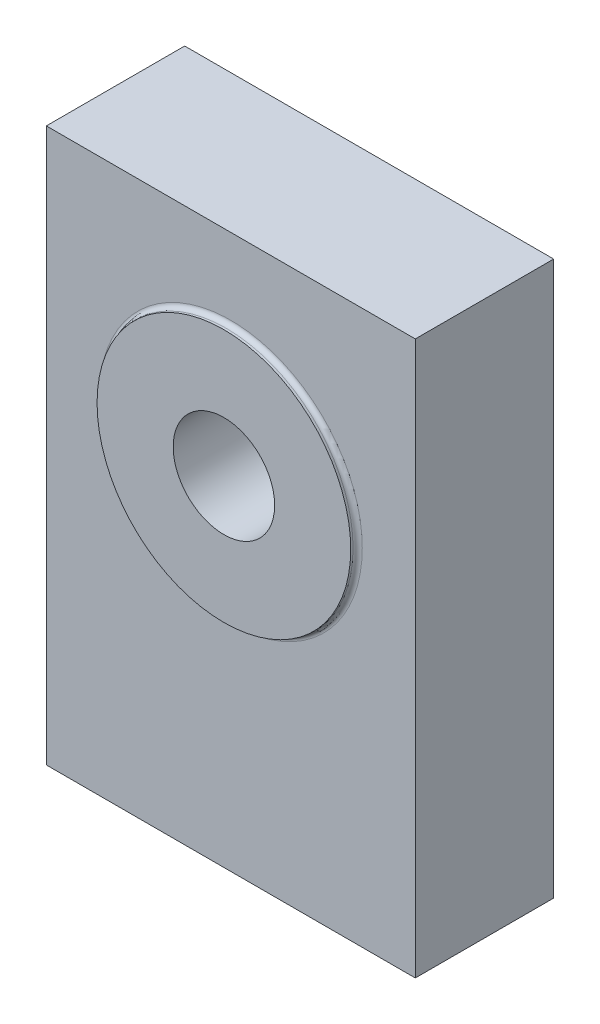
ISO-10303-21;
HEADER;
FILE_DESCRIPTION(('STEP AP214'),'2;1');
FILE_NAME('part.step','',(''),(''),'','','');
FILE_SCHEMA(('AUTOMOTIVE_DESIGN { 1 0 10303 214 1 1 1 1 }'));
ENDSEC;
DATA;
#1=APPLICATION_CONTEXT('core data for automotive mechanical design processes');
#2=APPLICATION_PROTOCOL_DEFINITION('international standard','automotive_design',2000,#1);
#3=PRODUCT_CONTEXT('',#1,'mechanical');
#4=PRODUCT('Part','Part','',(#3));
#5=PRODUCT_RELATED_PRODUCT_CATEGORY('part','',(#4));
#6=PRODUCT_DEFINITION_FORMATION('','',#4);
#7=PRODUCT_DEFINITION_CONTEXT('part definition',#1,'design');
#8=PRODUCT_DEFINITION('design','',#6,#7);
#9=PRODUCT_DEFINITION_SHAPE('','',#8);
#10=(LENGTH_UNIT() NAMED_UNIT(*) SI_UNIT(.MILLI.,.METRE.));
#11=(NAMED_UNIT(*) PLANE_ANGLE_UNIT() SI_UNIT($,.RADIAN.));
#12=(NAMED_UNIT(*) SI_UNIT($,.STERADIAN.) SOLID_ANGLE_UNIT());
#13=UNCERTAINTY_MEASURE_WITH_UNIT(LENGTH_MEASURE(1.E-05),#10,'distance_accuracy_value','');
#14=(GEOMETRIC_REPRESENTATION_CONTEXT(3) GLOBAL_UNCERTAINTY_ASSIGNED_CONTEXT((#13)) GLOBAL_UNIT_ASSIGNED_CONTEXT((#10,
#11,#12)) REPRESENTATION_CONTEXT('',''));
#15=CARTESIAN_POINT('',(0.,0.,0.));
#16=DIRECTION('',(0.,0.,1.));
#17=DIRECTION('',(1.,0.,0.));
#18=AXIS2_PLACEMENT_3D('',#15,#16,#17);
#19=CARTESIAN_POINT('',(-40.,120.,15.));
#20=DIRECTION('',(0.,0.,-1.));
#21=DIRECTION('',(-1.,0.,0.));
#22=AXIS2_PLACEMENT_3D('',#19,#20,#21);
#23=PLANE('',#22);
#24=CARTESIAN_POINT('',(0.,75.,15.));
#25=DIRECTION('',(0.,0.,-1.));
#26=DIRECTION('',(-1.,0.,0.));
#27=AXIS2_PLACEMENT_3D('',#24,#25,#26);
#28=CIRCLE('',#27,28.5);
#29=CARTESIAN_POINT('',(-28.5,75.,15.));
#30=VERTEX_POINT('',#29);
#31=EDGE_CURVE('E11',#30,#30,#28,.T.);
#32=ORIENTED_EDGE('',*,*,#31,.T.);
#33=EDGE_LOOP('',(#32));
#34=FACE_BOUND('',#33,.T.);
#35=DIRECTION('',(1.,0.,0.));
#36=VECTOR('',#35,1.);
#37=CARTESIAN_POINT('',(-40.,0.,15.));
#38=LINE('',#37,#36);
#39=CARTESIAN_POINT('',(-40.,0.,15.));
#40=VERTEX_POINT('',#39);
#41=CARTESIAN_POINT('',(40.,0.,15.));
#42=VERTEX_POINT('',#41);
#43=EDGE_CURVE('E72',#40,#42,#38,.T.);
#44=ORIENTED_EDGE('',*,*,#43,.T.);
#45=DIRECTION('',(0.,-1.,0.));
#46=VECTOR('',#45,1.);
#47=CARTESIAN_POINT('',(40.,120.,15.));
#48=LINE('',#47,#46);
#49=CARTESIAN_POINT('',(40.,120.,15.));
#50=VERTEX_POINT('',#49);
#51=EDGE_CURVE('E96',#50,#42,#48,.T.);
#52=ORIENTED_EDGE('',*,*,#51,.F.);
#53=DIRECTION('',(1.,0.,0.));
#54=VECTOR('',#53,1.);
#55=CARTESIAN_POINT('',(-40.,120.,15.));
#56=LINE('',#55,#54);
#57=CARTESIAN_POINT('',(-40.,120.,15.));
#58=VERTEX_POINT('',#57);
#59=EDGE_CURVE('E49',#58,#50,#56,.T.);
#60=ORIENTED_EDGE('',*,*,#59,.F.);
#61=DIRECTION('',(0.,-1.,0.));
#62=VECTOR('',#61,1.);
#63=CARTESIAN_POINT('',(-40.,120.,15.));
#64=LINE('',#63,#62);
#65=EDGE_CURVE('E92',#58,#40,#64,.T.);
#66=ORIENTED_EDGE('',*,*,#65,.T.);
#67=EDGE_LOOP('',(#44,#52,#60,#66));
#68=FACE_BOUND('',#67,.T.);
#69=ADVANCED_FACE('F32',(#34,#68),#23,.F.);
#70=CARTESIAN_POINT('',(40.,120.,15.));
#71=DIRECTION('',(-1.,0.,0.));
#72=DIRECTION('',(0.,0.,1.));
#73=AXIS2_PLACEMENT_3D('',#70,#71,#72);
#74=PLANE('',#73);
#75=DIRECTION('',(0.,0.,-1.));
#76=VECTOR('',#75,1.);
#77=CARTESIAN_POINT('',(40.,0.,15.));
#78=LINE('',#77,#76);
#79=CARTESIAN_POINT('',(40.,0.,-15.));
#80=VERTEX_POINT('',#79);
#81=EDGE_CURVE('E100',#42,#80,#78,.T.);
#82=ORIENTED_EDGE('',*,*,#81,.T.);
#83=DIRECTION('',(0.,-1.,0.));
#84=VECTOR('',#83,1.);
#85=CARTESIAN_POINT('',(40.,120.,-15.));
#86=LINE('',#85,#84);
#87=CARTESIAN_POINT('',(40.,120.,-15.));
#88=VERTEX_POINT('',#87);
#89=EDGE_CURVE('E91',#88,#80,#86,.T.);
#90=ORIENTED_EDGE('',*,*,#89,.F.);
#91=DIRECTION('',(0.,0.,-1.));
#92=VECTOR('',#91,1.);
#93=CARTESIAN_POINT('',(40.,120.,15.));
#94=LINE('',#93,#92);
#95=EDGE_CURVE('E85',#50,#88,#94,.T.);
#96=ORIENTED_EDGE('',*,*,#95,.F.);
#97=ORIENTED_EDGE('',*,*,#51,.T.);
#98=EDGE_LOOP('',(#82,#90,#96,#97));
#99=FACE_BOUND('',#98,.T.);
#100=ADVANCED_FACE('F126',(#99),#74,.F.);
#101=CARTESIAN_POINT('',(-40.,120.,-15.));
#102=DIRECTION('',(0.,0.,1.));
#103=DIRECTION('',(1.,0.,0.));
#104=AXIS2_PLACEMENT_3D('',#101,#102,#103);
#105=PLANE('',#104);
#106=CARTESIAN_POINT('',(0.,75.,-15.));
#107=DIRECTION('',(0.,0.,1.));
#108=DIRECTION('',(1.,0.,0.));
#109=AXIS2_PLACEMENT_3D('',#106,#107,#108);
#110=CIRCLE('',#109,11.);
#111=CARTESIAN_POINT('',(11.,75.,-15.));
#112=VERTEX_POINT('',#111);
#113=EDGE_CURVE('E145',#112,#112,#110,.T.);
#114=ORIENTED_EDGE('',*,*,#113,.T.);
#115=EDGE_LOOP('',(#114));
#116=FACE_BOUND('',#115,.T.);
#117=DIRECTION('',(-1.,0.,0.));
#118=VECTOR('',#117,1.);
#119=CARTESIAN_POINT('',(-40.,0.,-15.));
#120=LINE('',#119,#118);
#121=CARTESIAN_POINT('',(-40.,0.,-15.));
#122=VERTEX_POINT('',#121);
#123=EDGE_CURVE('E90',#80,#122,#120,.T.);
#124=ORIENTED_EDGE('',*,*,#123,.T.);
#125=DIRECTION('',(0.,-1.,0.));
#126=VECTOR('',#125,1.);
#127=CARTESIAN_POINT('',(-40.,120.,-15.));
#128=LINE('',#127,#126);
#129=CARTESIAN_POINT('',(-40.,120.,-15.));
#130=VERTEX_POINT('',#129);
#131=EDGE_CURVE('E88',#130,#122,#128,.T.);
#132=ORIENTED_EDGE('',*,*,#131,.F.);
#133=DIRECTION('',(-1.,0.,0.));
#134=VECTOR('',#133,1.);
#135=CARTESIAN_POINT('',(-40.,120.,-15.));
#136=LINE('',#135,#134);
#137=EDGE_CURVE('E80',#88,#130,#136,.T.);
#138=ORIENTED_EDGE('',*,*,#137,.F.);
#139=ORIENTED_EDGE('',*,*,#89,.T.);
#140=EDGE_LOOP('',(#124,#132,#138,#139));
#141=FACE_BOUND('',#140,.T.);
#142=ADVANCED_FACE('F89',(#116,#141),#105,.F.);
#143=CARTESIAN_POINT('',(-40.,120.,15.));
#144=DIRECTION('',(1.,0.,0.));
#145=DIRECTION('',(0.,0.,-1.));
#146=AXIS2_PLACEMENT_3D('',#143,#144,#145);
#147=PLANE('',#146);
#148=DIRECTION('',(0.,0.,1.));
#149=VECTOR('',#148,1.);
#150=CARTESIAN_POINT('',(-40.,0.,15.));
#151=LINE('',#150,#149);
#152=EDGE_CURVE('E66',#122,#40,#151,.T.);
#153=ORIENTED_EDGE('',*,*,#152,.T.);
#154=ORIENTED_EDGE('',*,*,#65,.F.);
#155=DIRECTION('',(0.,0.,1.));
#156=VECTOR('',#155,1.);
#157=CARTESIAN_POINT('',(-40.,120.,15.));
#158=LINE('',#157,#156);
#159=EDGE_CURVE('E83',#130,#58,#158,.T.);
#160=ORIENTED_EDGE('',*,*,#159,.F.);
#161=ORIENTED_EDGE('',*,*,#131,.T.);
#162=EDGE_LOOP('',(#153,#154,#160,#161));
#163=FACE_BOUND('',#162,.T.);
#164=ADVANCED_FACE('F94',(#163),#147,.F.);
#165=CARTESIAN_POINT('',(0.,120.,0.));
#166=DIRECTION('',(0.,-1.,0.));
#167=DIRECTION('',(0.,0.,-1.));
#168=AXIS2_PLACEMENT_3D('',#165,#166,#167);
#169=PLANE('',#168);
#170=ORIENTED_EDGE('',*,*,#95,.T.);
#171=ORIENTED_EDGE('',*,*,#137,.T.);
#172=ORIENTED_EDGE('',*,*,#159,.T.);
#173=ORIENTED_EDGE('',*,*,#59,.T.);
#174=EDGE_LOOP('',(#170,#171,#172,#173));
#175=FACE_BOUND('',#174,.T.);
#176=ADVANCED_FACE('F81',(#175),#169,.F.);
#177=CARTESIAN_POINT('',(0.,0.,0.));
#178=DIRECTION('',(0.,-1.,0.));
#179=DIRECTION('',(0.,0.,-1.));
#180=AXIS2_PLACEMENT_3D('',#177,#178,#179);
#181=PLANE('',#180);
#182=ORIENTED_EDGE('',*,*,#81,.F.);
#183=ORIENTED_EDGE('',*,*,#43,.F.);
#184=ORIENTED_EDGE('',*,*,#152,.F.);
#185=ORIENTED_EDGE('',*,*,#123,.F.);
#186=EDGE_LOOP('',(#182,#183,#184,#185));
#187=FACE_BOUND('',#186,.T.);
#188=ADVANCED_FACE('F135',(#187),#181,.T.);
#189=CARTESIAN_POINT('',(0.,75.,16.5));
#190=DIRECTION('',(0.,0.,-1.));
#191=DIRECTION('',(-1.,0.,0.));
#192=AXIS2_PLACEMENT_3D('',#189,#190,#191);
#193=CYLINDRICAL_SURFACE('',#192,27.5);
#194=CARTESIAN_POINT('',(0.,75.,16.));
#195=DIRECTION('',(0.,0.,-1.));
#196=DIRECTION('',(-1.,0.,0.));
#197=AXIS2_PLACEMENT_3D('',#194,#195,#196);
#198=CIRCLE('',#197,27.5);
#199=CARTESIAN_POINT('',(-27.5,75.,16.));
#200=VERTEX_POINT('',#199);
#201=EDGE_CURVE('E41',#200,#200,#198,.F.);
#202=ORIENTED_EDGE('',*,*,#201,.T.);
#203=EDGE_LOOP('',(#202));
#204=FACE_BOUND('',#203,.T.);
#205=CARTESIAN_POINT('',(0.,75.,16.5));
#206=DIRECTION('',(0.,0.,1.));
#207=DIRECTION('',(1.,0.,0.));
#208=AXIS2_PLACEMENT_3D('',#205,#206,#207);
#209=CIRCLE('',#208,27.5);
#210=CARTESIAN_POINT('',(27.5,75.,16.5));
#211=VERTEX_POINT('',#210);
#212=EDGE_CURVE('E103',#211,#211,#209,.T.);
#213=ORIENTED_EDGE('',*,*,#212,.F.);
#214=EDGE_LOOP('',(#213));
#215=FACE_BOUND('',#214,.T.);
#216=ADVANCED_FACE('F112',(#204,#215),#193,.T.);
#217=CARTESIAN_POINT('',(0.,75.,16.5));
#218=DIRECTION('',(0.,0.,1.));
#219=DIRECTION('',(1.,0.,0.));
#220=AXIS2_PLACEMENT_3D('',#217,#218,#219);
#221=PLANE('',#220);
#222=CARTESIAN_POINT('',(0.,75.,16.5));
#223=DIRECTION('',(0.,0.,1.));
#224=DIRECTION('',(1.,0.,0.));
#225=AXIS2_PLACEMENT_3D('',#222,#223,#224);
#226=CIRCLE('',#225,11.);
#227=CARTESIAN_POINT('',(11.,75.,16.5));
#228=VERTEX_POINT('',#227);
#229=EDGE_CURVE('E147',#228,#228,#226,.T.);
#230=ORIENTED_EDGE('',*,*,#229,.F.);
#231=EDGE_LOOP('',(#230));
#232=FACE_BOUND('',#231,.T.);
#233=ORIENTED_EDGE('',*,*,#212,.T.);
#234=EDGE_LOOP('',(#233));
#235=FACE_BOUND('',#234,.T.);
#236=ADVANCED_FACE('F121',(#232,#235),#221,.T.);
#237=CARTESIAN_POINT('',(0.,75.,-23.));
#238=DIRECTION('',(0.,0.,1.));
#239=DIRECTION('',(1.,0.,0.));
#240=AXIS2_PLACEMENT_3D('',#237,#238,#239);
#241=CYLINDRICAL_SURFACE('',#240,11.);
#242=ORIENTED_EDGE('',*,*,#229,.T.);
#243=EDGE_LOOP('',(#242));
#244=FACE_BOUND('',#243,.T.);
#245=ORIENTED_EDGE('',*,*,#113,.F.);
#246=EDGE_LOOP('',(#245));
#247=FACE_BOUND('',#246,.T.);
#248=ADVANCED_FACE('F116',(#244,#247),#241,.F.);
#249=CARTESIAN_POINT('',(0.,75.,16.));
#250=DIRECTION('',(0.,0.,-1.));
#251=DIRECTION('',(-1.,0.,0.));
#252=AXIS2_PLACEMENT_3D('',#249,#250,#251);
#253=TOROIDAL_SURFACE('',#252,28.5,1.);
#254=ORIENTED_EDGE('',*,*,#31,.F.);
#255=EDGE_LOOP('',(#254));
#256=FACE_BOUND('',#255,.T.);
#257=ORIENTED_EDGE('',*,*,#201,.F.);
#258=EDGE_LOOP('',(#257));
#259=FACE_BOUND('',#258,.T.);
#260=ADVANCED_FACE('F34',(#256,#259),#253,.F.);
#261=CLOSED_SHELL('',(#69,#100,#142,#164,#176,#188,#216,#236,#248,#260));
#262=MANIFOLD_SOLID_BREP('B2',#261);
#263=ADVANCED_BREP_SHAPE_REPRESENTATION('',(#18,#262),#14);
#264=SHAPE_DEFINITION_REPRESENTATION(#9,#263);
ENDSEC;
END-ISO-10303-21;
